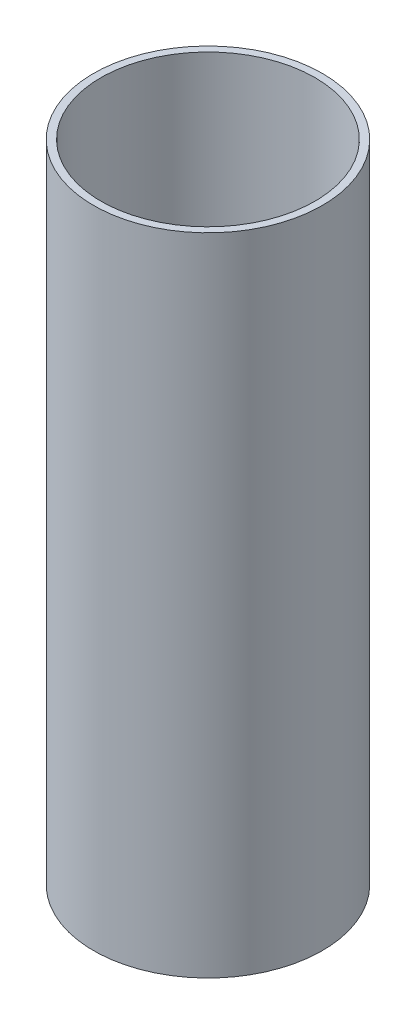
ISO-10303-21;
HEADER;
FILE_DESCRIPTION(('STEP AP214'),'2;1');
FILE_NAME('part.step','',(''),(''),'','','');
FILE_SCHEMA(('AUTOMOTIVE_DESIGN { 1 0 10303 214 1 1 1 1 }'));
ENDSEC;
DATA;
#1=APPLICATION_CONTEXT('core data for automotive mechanical design processes');
#2=APPLICATION_PROTOCOL_DEFINITION('international standard','automotive_design',2000,#1);
#3=PRODUCT_CONTEXT('',#1,'mechanical');
#4=PRODUCT('Part','Part','',(#3));
#5=PRODUCT_RELATED_PRODUCT_CATEGORY('part','',(#4));
#6=PRODUCT_DEFINITION_FORMATION('','',#4);
#7=PRODUCT_DEFINITION_CONTEXT('part definition',#1,'design');
#8=PRODUCT_DEFINITION('design','',#6,#7);
#9=PRODUCT_DEFINITION_SHAPE('','',#8);
#10=(LENGTH_UNIT() NAMED_UNIT(*) SI_UNIT(.MILLI.,.METRE.));
#11=(NAMED_UNIT(*) PLANE_ANGLE_UNIT() SI_UNIT($,.RADIAN.));
#12=(NAMED_UNIT(*) SI_UNIT($,.STERADIAN.) SOLID_ANGLE_UNIT());
#13=UNCERTAINTY_MEASURE_WITH_UNIT(LENGTH_MEASURE(1.E-05),#10,'distance_accuracy_value','');
#14=(GEOMETRIC_REPRESENTATION_CONTEXT(3) GLOBAL_UNCERTAINTY_ASSIGNED_CONTEXT((#13)) GLOBAL_UNIT_ASSIGNED_CONTEXT((#10,
#11,#12)) REPRESENTATION_CONTEXT('',''));
#15=CARTESIAN_POINT('',(0.,0.,0.));
#16=DIRECTION('',(0.,0.,1.));
#17=DIRECTION('',(1.,0.,0.));
#18=AXIS2_PLACEMENT_3D('',#15,#16,#17);
#19=CARTESIAN_POINT('',(0.,-13.97,0.));
#20=DIRECTION('',(0.,-1.,0.));
#21=DIRECTION('',(0.,0.,-1.));
#22=AXIS2_PLACEMENT_3D('',#19,#20,#21);
#23=CYLINDRICAL_SURFACE('',#22,46.355);
#24=CARTESIAN_POINT('',(0.,0.,0.));
#25=DIRECTION('',(0.,-1.,0.));
#26=DIRECTION('',(0.,0.,-1.));
#27=AXIS2_PLACEMENT_3D('',#24,#25,#26);
#28=CIRCLE('',#27,46.355);
#29=CARTESIAN_POINT('',(0.,0.,-46.355));
#30=VERTEX_POINT('',#29);
#31=EDGE_CURVE('E58',#30,#30,#28,.T.);
#32=ORIENTED_EDGE('',*,*,#31,.T.);
#33=EDGE_LOOP('',(#32));
#34=FACE_BOUND('',#33,.T.);
#35=CARTESIAN_POINT('',(0.,279.4,0.));
#36=DIRECTION('',(0.,-1.,0.));
#37=DIRECTION('',(0.,0.,-1.));
#38=AXIS2_PLACEMENT_3D('',#35,#36,#37);
#39=CIRCLE('',#38,46.355);
#40=CARTESIAN_POINT('',(0.,279.4,-46.355));
#41=VERTEX_POINT('',#40);
#42=EDGE_CURVE('E10',#41,#41,#39,.T.);
#43=ORIENTED_EDGE('',*,*,#42,.F.);
#44=EDGE_LOOP('',(#43));
#45=FACE_BOUND('',#44,.T.);
#46=ADVANCED_FACE('F41',(#34,#45),#23,.F.);
#47=CARTESIAN_POINT('',(46.355,279.4,0.));
#48=DIRECTION('',(0.,1.,0.));
#49=DIRECTION('',(0.,0.,1.));
#50=AXIS2_PLACEMENT_3D('',#47,#48,#49);
#51=PLANE('',#50);
#52=ORIENTED_EDGE('',*,*,#42,.T.);
#53=EDGE_LOOP('',(#52));
#54=FACE_BOUND('',#53,.T.);
#55=CARTESIAN_POINT('',(0.,279.4,0.));
#56=DIRECTION('',(0.,-1.,0.));
#57=DIRECTION('',(0.,0.,-1.));
#58=AXIS2_PLACEMENT_3D('',#55,#56,#57);
#59=CIRCLE('',#58,49.53);
#60=CARTESIAN_POINT('',(0.,279.4,-49.53));
#61=VERTEX_POINT('',#60);
#62=EDGE_CURVE('E48',#61,#61,#59,.T.);
#63=ORIENTED_EDGE('',*,*,#62,.F.);
#64=EDGE_LOOP('',(#63));
#65=FACE_BOUND('',#64,.T.);
#66=ADVANCED_FACE('F75',(#54,#65),#51,.T.);
#67=CARTESIAN_POINT('',(0.,-13.97,0.));
#68=DIRECTION('',(0.,-1.,0.));
#69=DIRECTION('',(0.,0.,-1.));
#70=AXIS2_PLACEMENT_3D('',#67,#68,#69);
#71=CYLINDRICAL_SURFACE('',#70,49.53);
#72=ORIENTED_EDGE('',*,*,#62,.T.);
#73=EDGE_LOOP('',(#72));
#74=FACE_BOUND('',#73,.T.);
#75=CARTESIAN_POINT('',(0.,0.,0.));
#76=DIRECTION('',(0.,-1.,0.));
#77=DIRECTION('',(0.,0.,-1.));
#78=AXIS2_PLACEMENT_3D('',#75,#76,#77);
#79=CIRCLE('',#78,49.53);
#80=CARTESIAN_POINT('',(0.,0.,-49.53));
#81=VERTEX_POINT('',#80);
#82=EDGE_CURVE('E53',#81,#81,#79,.T.);
#83=ORIENTED_EDGE('',*,*,#82,.F.);
#84=EDGE_LOOP('',(#83));
#85=FACE_BOUND('',#84,.T.);
#86=ADVANCED_FACE('F69',(#74,#85),#71,.T.);
#87=CARTESIAN_POINT('',(46.355,0.,0.));
#88=DIRECTION('',(0.,-1.,0.));
#89=DIRECTION('',(0.,0.,-1.));
#90=AXIS2_PLACEMENT_3D('',#87,#88,#89);
#91=PLANE('',#90);
#92=ORIENTED_EDGE('',*,*,#82,.T.);
#93=EDGE_LOOP('',(#92));
#94=FACE_BOUND('',#93,.T.);
#95=ORIENTED_EDGE('',*,*,#31,.F.);
#96=EDGE_LOOP('',(#95));
#97=FACE_BOUND('',#96,.T.);
#98=ADVANCED_FACE('F67',(#94,#97),#91,.T.);
#99=CLOSED_SHELL('',(#46,#66,#86,#98));
#100=MANIFOLD_SOLID_BREP('B2',#99);
#101=ADVANCED_BREP_SHAPE_REPRESENTATION('',(#18,#100),#14);
#102=SHAPE_DEFINITION_REPRESENTATION(#9,#101);
ENDSEC;
END-ISO-10303-21;
